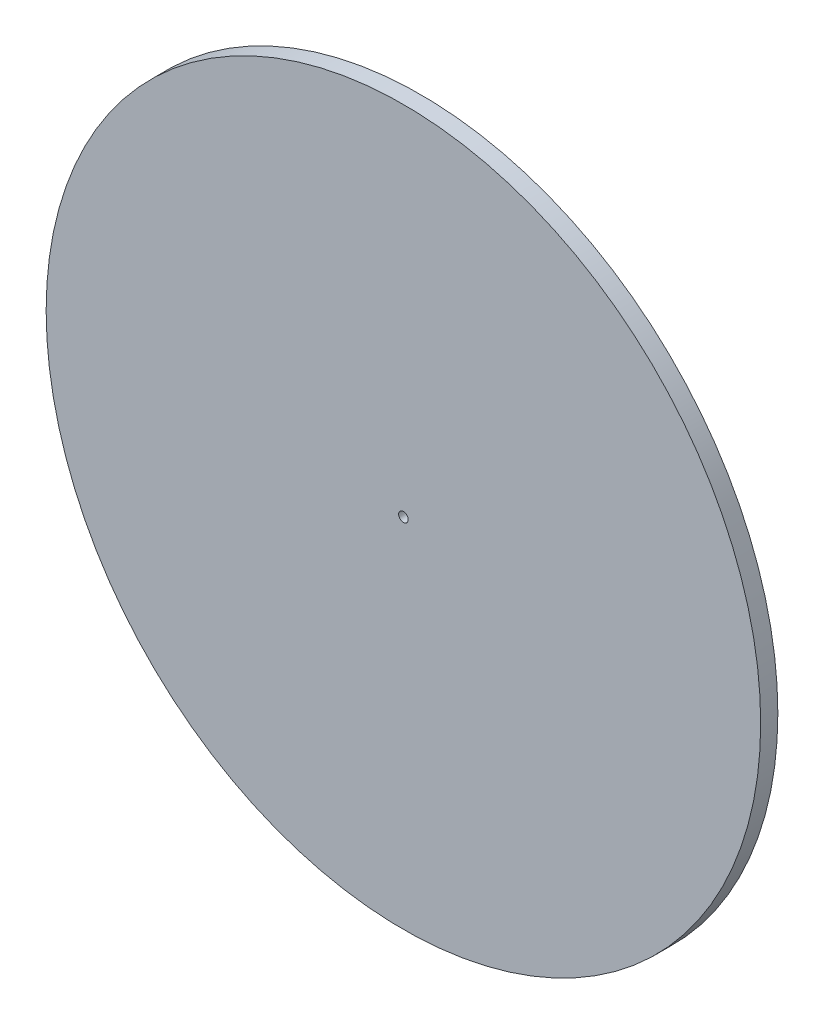
ISO-10303-21;
HEADER;
FILE_DESCRIPTION(('STEP AP214'),'2;1');
FILE_NAME('part.step','',(''),(''),'','','');
FILE_SCHEMA(('AUTOMOTIVE_DESIGN { 1 0 10303 214 1 1 1 1 }'));
ENDSEC;
DATA;
#1=APPLICATION_CONTEXT('core data for automotive mechanical design processes');
#2=APPLICATION_PROTOCOL_DEFINITION('international standard','automotive_design',2000,#1);
#3=PRODUCT_CONTEXT('',#1,'mechanical');
#4=PRODUCT('Part','Part','',(#3));
#5=PRODUCT_RELATED_PRODUCT_CATEGORY('part','',(#4));
#6=PRODUCT_DEFINITION_FORMATION('','',#4);
#7=PRODUCT_DEFINITION_CONTEXT('part definition',#1,'design');
#8=PRODUCT_DEFINITION('design','',#6,#7);
#9=PRODUCT_DEFINITION_SHAPE('','',#8);
#10=(LENGTH_UNIT() NAMED_UNIT(*) SI_UNIT(.MILLI.,.METRE.));
#11=(NAMED_UNIT(*) PLANE_ANGLE_UNIT() SI_UNIT($,.RADIAN.));
#12=(NAMED_UNIT(*) SI_UNIT($,.STERADIAN.) SOLID_ANGLE_UNIT());
#13=UNCERTAINTY_MEASURE_WITH_UNIT(LENGTH_MEASURE(1.E-05),#10,'distance_accuracy_value','');
#14=(GEOMETRIC_REPRESENTATION_CONTEXT(3) GLOBAL_UNCERTAINTY_ASSIGNED_CONTEXT((#13)) GLOBAL_UNIT_ASSIGNED_CONTEXT((#10,
#11,#12)) REPRESENTATION_CONTEXT('',''));
#15=CARTESIAN_POINT('',(0.,0.,0.));
#16=DIRECTION('',(0.,0.,1.));
#17=DIRECTION('',(1.,0.,0.));
#18=AXIS2_PLACEMENT_3D('',#15,#16,#17);
#19=CARTESIAN_POINT('',(0.,0.,18.));
#20=DIRECTION('',(0.,0.,1.));
#21=DIRECTION('',(1.,0.,0.));
#22=AXIS2_PLACEMENT_3D('',#19,#20,#21);
#23=PLANE('',#22);
#24=CARTESIAN_POINT('',(0.,0.,18.));
#25=DIRECTION('',(0.,0.,1.));
#26=DIRECTION('',(1.,0.,0.));
#27=AXIS2_PLACEMENT_3D('',#24,#25,#26);
#28=CIRCLE('',#27,750.);
#29=CARTESIAN_POINT('',(750.,0.,18.));
#30=VERTEX_POINT('',#29);
#31=EDGE_CURVE('E10',#30,#30,#28,.T.);
#32=ORIENTED_EDGE('',*,*,#31,.T.);
#33=EDGE_LOOP('',(#32));
#34=FACE_BOUND('',#33,.T.);
#35=CARTESIAN_POINT('',(0.,0.,18.));
#36=DIRECTION('',(0.,0.,1.));
#37=DIRECTION('',(1.,0.,0.));
#38=AXIS2_PLACEMENT_3D('',#35,#36,#37);
#39=CIRCLE('',#38,10.);
#40=CARTESIAN_POINT('',(10.,0.,18.));
#41=VERTEX_POINT('',#40);
#42=EDGE_CURVE('E42',#41,#41,#39,.T.);
#43=ORIENTED_EDGE('',*,*,#42,.F.);
#44=EDGE_LOOP('',(#43));
#45=FACE_BOUND('',#44,.T.);
#46=ADVANCED_FACE('F31',(#34,#45),#23,.T.);
#47=CARTESIAN_POINT('',(0.,0.,-18.));
#48=DIRECTION('',(0.,0.,1.));
#49=DIRECTION('',(1.,0.,0.));
#50=AXIS2_PLACEMENT_3D('',#47,#48,#49);
#51=PLANE('',#50);
#52=CARTESIAN_POINT('',(0.,0.,-18.));
#53=DIRECTION('',(0.,0.,1.));
#54=DIRECTION('',(1.,0.,0.));
#55=AXIS2_PLACEMENT_3D('',#52,#53,#54);
#56=CIRCLE('',#55,750.);
#57=CARTESIAN_POINT('',(750.,0.,-18.));
#58=VERTEX_POINT('',#57);
#59=EDGE_CURVE('E35',#58,#58,#56,.T.);
#60=ORIENTED_EDGE('',*,*,#59,.F.);
#61=EDGE_LOOP('',(#60));
#62=FACE_BOUND('',#61,.T.);
#63=CARTESIAN_POINT('',(0.,0.,-18.));
#64=DIRECTION('',(0.,0.,1.));
#65=DIRECTION('',(1.,0.,0.));
#66=AXIS2_PLACEMENT_3D('',#63,#64,#65);
#67=CIRCLE('',#66,10.);
#68=CARTESIAN_POINT('',(10.,0.,-18.));
#69=VERTEX_POINT('',#68);
#70=EDGE_CURVE('E44',#69,#69,#67,.T.);
#71=ORIENTED_EDGE('',*,*,#70,.T.);
#72=EDGE_LOOP('',(#71));
#73=FACE_BOUND('',#72,.T.);
#74=ADVANCED_FACE('F54',(#62,#73),#51,.F.);
#75=CARTESIAN_POINT('',(0.,0.,18.));
#76=DIRECTION('',(0.,0.,-1.));
#77=DIRECTION('',(-1.,0.,0.));
#78=AXIS2_PLACEMENT_3D('',#75,#76,#77);
#79=CYLINDRICAL_SURFACE('',#78,750.);
#80=ORIENTED_EDGE('',*,*,#31,.F.);
#81=EDGE_LOOP('',(#80));
#82=FACE_BOUND('',#81,.T.);
#83=ORIENTED_EDGE('',*,*,#59,.T.);
#84=EDGE_LOOP('',(#83));
#85=FACE_BOUND('',#84,.T.);
#86=ADVANCED_FACE('F33',(#82,#85),#79,.T.);
#87=CARTESIAN_POINT('',(0.,0.,18.));
#88=DIRECTION('',(0.,0.,-1.));
#89=DIRECTION('',(-1.,0.,0.));
#90=AXIS2_PLACEMENT_3D('',#87,#88,#89);
#91=CYLINDRICAL_SURFACE('',#90,10.);
#92=ORIENTED_EDGE('',*,*,#42,.T.);
#93=EDGE_LOOP('',(#92));
#94=FACE_BOUND('',#93,.T.);
#95=ORIENTED_EDGE('',*,*,#70,.F.);
#96=EDGE_LOOP('',(#95));
#97=FACE_BOUND('',#96,.T.);
#98=ADVANCED_FACE('F50',(#94,#97),#91,.F.);
#99=CLOSED_SHELL('',(#46,#74,#86,#98));
#100=MANIFOLD_SOLID_BREP('B2',#99);
#101=ADVANCED_BREP_SHAPE_REPRESENTATION('',(#18,#100),#14);
#102=SHAPE_DEFINITION_REPRESENTATION(#9,#101);
ENDSEC;
END-ISO-10303-21;
